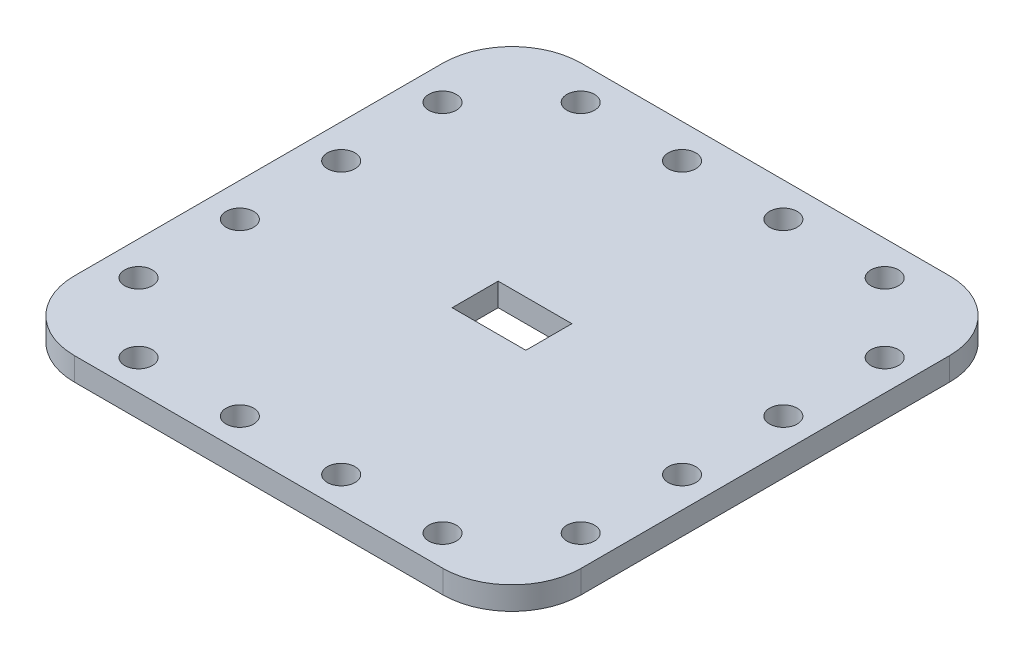
ISO-10303-21;
HEADER;
FILE_DESCRIPTION(('STEP AP214'),'2;1');
FILE_NAME('part.step','',(''),(''),'','','');
FILE_SCHEMA(('AUTOMOTIVE_DESIGN { 1 0 10303 214 1 1 1 1 }'));
ENDSEC;
DATA;
#1=APPLICATION_CONTEXT('core data for automotive mechanical design processes');
#2=APPLICATION_PROTOCOL_DEFINITION('international standard','automotive_design',2000,#1);
#3=PRODUCT_CONTEXT('',#1,'mechanical');
#4=PRODUCT('Part','Part','',(#3));
#5=PRODUCT_RELATED_PRODUCT_CATEGORY('part','',(#4));
#6=PRODUCT_DEFINITION_FORMATION('','',#4);
#7=PRODUCT_DEFINITION_CONTEXT('part definition',#1,'design');
#8=PRODUCT_DEFINITION('design','',#6,#7);
#9=PRODUCT_DEFINITION_SHAPE('','',#8);
#10=(LENGTH_UNIT() NAMED_UNIT(*) SI_UNIT(.MILLI.,.METRE.));
#11=(NAMED_UNIT(*) PLANE_ANGLE_UNIT() SI_UNIT($,.RADIAN.));
#12=(NAMED_UNIT(*) SI_UNIT($,.STERADIAN.) SOLID_ANGLE_UNIT());
#13=UNCERTAINTY_MEASURE_WITH_UNIT(LENGTH_MEASURE(1.E-05),#10,'distance_accuracy_value','');
#14=(GEOMETRIC_REPRESENTATION_CONTEXT(3) GLOBAL_UNCERTAINTY_ASSIGNED_CONTEXT((#13)) GLOBAL_UNIT_ASSIGNED_CONTEXT((#10,
#11,#12)) REPRESENTATION_CONTEXT('',''));
#15=CARTESIAN_POINT('',(0.,0.,0.));
#16=DIRECTION('',(0.,0.,1.));
#17=DIRECTION('',(1.,0.,0.));
#18=AXIS2_PLACEMENT_3D('',#15,#16,#17);
#19=CARTESIAN_POINT('',(40.,5.,55.));
#20=DIRECTION('',(0.,1.,0.));
#21=DIRECTION('',(0.,0.,1.));
#22=AXIS2_PLACEMENT_3D('',#19,#20,#21);
#23=PLANE('',#22);
#24=DIRECTION('',(0.,0.,-1.));
#25=VECTOR('',#24,1.);
#26=CARTESIAN_POINT('',(8.,5.,5.));
#27=LINE('',#26,#25);
#28=CARTESIAN_POINT('',(8.,5.,5.));
#29=VERTEX_POINT('',#28);
#30=CARTESIAN_POINT('',(8.,5.,-5.));
#31=VERTEX_POINT('',#30);
#32=EDGE_CURVE('E54',#29,#31,#27,.T.);
#33=ORIENTED_EDGE('',*,*,#32,.F.);
#34=DIRECTION('',(1.,0.,0.));
#35=VECTOR('',#34,1.);
#36=CARTESIAN_POINT('',(-8.,5.,5.));
#37=LINE('',#36,#35);
#38=CARTESIAN_POINT('',(-8.,5.,5.));
#39=VERTEX_POINT('',#38);
#40=EDGE_CURVE('E145',#39,#29,#37,.T.);
#41=ORIENTED_EDGE('',*,*,#40,.F.);
#42=DIRECTION('',(0.,0.,1.));
#43=VECTOR('',#42,1.);
#44=CARTESIAN_POINT('',(-8.,5.,5.));
#45=LINE('',#44,#43);
#46=CARTESIAN_POINT('',(-8.,5.,-5.));
#47=VERTEX_POINT('',#46);
#48=EDGE_CURVE('E130',#47,#39,#45,.T.);
#49=ORIENTED_EDGE('',*,*,#48,.F.);
#50=DIRECTION('',(-1.,0.,0.));
#51=VECTOR('',#50,1.);
#52=CARTESIAN_POINT('',(-8.,5.,-5.));
#53=LINE('',#52,#51);
#54=EDGE_CURVE('E139',#31,#47,#53,.T.);
#55=ORIENTED_EDGE('',*,*,#54,.F.);
#56=EDGE_LOOP('',(#33,#41,#49,#55));
#57=FACE_BOUND('',#56,.T.);
#58=CARTESIAN_POINT('',(48.3346963055934,5.,-10.5816296180082));
#59=DIRECTION('',(0.,-1.,0.));
#60=DIRECTION('',(0.,0.,-1.));
#61=AXIS2_PLACEMENT_3D('',#58,#59,#60);
#62=CIRCLE('',#61,3.00000000000002);
#63=CARTESIAN_POINT('',(48.3346963055934,5.,-13.5816296180082));
#64=VERTEX_POINT('',#63);
#65=EDGE_CURVE('E208',#64,#64,#62,.T.);
#66=ORIENTED_EDGE('',*,*,#65,.T.);
#67=EDGE_LOOP('',(#66));
#68=FACE_BOUND('',#67,.T.);
#69=CARTESIAN_POINT('',(-32.6653036944065,5.,-47.5816296180083));
#70=DIRECTION('',(0.,-1.,0.));
#71=DIRECTION('',(0.,0.,-1.));
#72=AXIS2_PLACEMENT_3D('',#69,#70,#71);
#73=CIRCLE('',#72,3.00000000000001);
#74=CARTESIAN_POINT('',(-32.6653036944065,5.,-50.5816296180083));
#75=VERTEX_POINT('',#74);
#76=EDGE_CURVE('E220',#75,#75,#73,.T.);
#77=ORIENTED_EDGE('',*,*,#76,.T.);
#78=EDGE_LOOP('',(#77));
#79=FACE_BOUND('',#78,.T.);
#80=CARTESIAN_POINT('',(-47.6653036944066,5.,-32.5816296180082));
#81=DIRECTION('',(0.,-1.,0.));
#82=DIRECTION('',(0.,0.,-1.));
#83=AXIS2_PLACEMENT_3D('',#80,#81,#82);
#84=CIRCLE('',#83,3.);
#85=CARTESIAN_POINT('',(-47.6653036944066,5.,-35.5816296180082));
#86=VERTEX_POINT('',#85);
#87=EDGE_CURVE('E223',#86,#86,#84,.T.);
#88=ORIENTED_EDGE('',*,*,#87,.T.);
#89=EDGE_LOOP('',(#88));
#90=FACE_BOUND('',#89,.T.);
#91=CARTESIAN_POINT('',(-47.6653036944066,5.,-10.5816296180082));
#92=DIRECTION('',(0.,-1.,0.));
#93=DIRECTION('',(0.,0.,-1.));
#94=AXIS2_PLACEMENT_3D('',#91,#92,#93);
#95=CIRCLE('',#94,3.00000000000003);
#96=CARTESIAN_POINT('',(-47.6653036944066,5.,-13.5816296180083));
#97=VERTEX_POINT('',#96);
#98=EDGE_CURVE('E226',#97,#97,#95,.T.);
#99=ORIENTED_EDGE('',*,*,#98,.T.);
#100=EDGE_LOOP('',(#99));
#101=FACE_BOUND('',#100,.T.);
#102=CARTESIAN_POINT('',(-47.6653036944066,5.,11.4183703819918));
#103=DIRECTION('',(0.,-1.,0.));
#104=DIRECTION('',(0.,0.,-1.));
#105=AXIS2_PLACEMENT_3D('',#102,#103,#104);
#106=CIRCLE('',#105,2.99999999999997);
#107=CARTESIAN_POINT('',(-47.6653036944066,5.,8.4183703819918));
#108=VERTEX_POINT('',#107);
#109=EDGE_CURVE('E229',#108,#108,#106,.T.);
#110=ORIENTED_EDGE('',*,*,#109,.T.);
#111=EDGE_LOOP('',(#110));
#112=FACE_BOUND('',#111,.T.);
#113=CARTESIAN_POINT('',(-10.6653036944066,5.,48.4183703819918));
#114=DIRECTION('',(0.,-1.,0.));
#115=DIRECTION('',(0.,0.,-1.));
#116=AXIS2_PLACEMENT_3D('',#113,#114,#115);
#117=CIRCLE('',#116,3.00000000000002);
#118=CARTESIAN_POINT('',(-10.6653036944066,5.,45.4183703819917));
#119=VERTEX_POINT('',#118);
#120=EDGE_CURVE('E232',#119,#119,#117,.T.);
#121=ORIENTED_EDGE('',*,*,#120,.T.);
#122=EDGE_LOOP('',(#121));
#123=FACE_BOUND('',#122,.T.);
#124=CARTESIAN_POINT('',(11.3346963055934,5.,48.4183703819918));
#125=DIRECTION('',(0.,-1.,0.));
#126=DIRECTION('',(0.,0.,-1.));
#127=AXIS2_PLACEMENT_3D('',#124,#125,#126);
#128=CIRCLE('',#127,2.99999999999997);
#129=CARTESIAN_POINT('',(11.3346963055934,5.,45.4183703819918));
#130=VERTEX_POINT('',#129);
#131=EDGE_CURVE('E235',#130,#130,#128,.T.);
#132=ORIENTED_EDGE('',*,*,#131,.T.);
#133=EDGE_LOOP('',(#132));
#134=FACE_BOUND('',#133,.T.);
#135=CARTESIAN_POINT('',(33.3346963055934,5.,48.4183703819918));
#136=DIRECTION('',(0.,-1.,0.));
#137=DIRECTION('',(0.,0.,-1.));
#138=AXIS2_PLACEMENT_3D('',#135,#136,#137);
#139=CIRCLE('',#138,3.00000000000001);
#140=CARTESIAN_POINT('',(33.3346963055934,5.,45.4183703819917));
#141=VERTEX_POINT('',#140);
#142=EDGE_CURVE('E238',#141,#141,#139,.T.);
#143=ORIENTED_EDGE('',*,*,#142,.T.);
#144=EDGE_LOOP('',(#143));
#145=FACE_BOUND('',#144,.T.);
#146=CARTESIAN_POINT('',(48.3346963055934,5.,11.4183703819918));
#147=DIRECTION('',(0.,-1.,0.));
#148=DIRECTION('',(0.,0.,-1.));
#149=AXIS2_PLACEMENT_3D('',#146,#147,#148);
#150=CIRCLE('',#149,2.99999999999997);
#151=CARTESIAN_POINT('',(48.3346963055934,5.,8.4183703819918));
#152=VERTEX_POINT('',#151);
#153=EDGE_CURVE('E241',#152,#152,#150,.T.);
#154=ORIENTED_EDGE('',*,*,#153,.T.);
#155=EDGE_LOOP('',(#154));
#156=FACE_BOUND('',#155,.T.);
#157=CARTESIAN_POINT('',(48.3346963055935,5.,-32.5816296180082));
#158=DIRECTION('',(0.,-1.,0.));
#159=DIRECTION('',(0.,0.,-1.));
#160=AXIS2_PLACEMENT_3D('',#157,#158,#159);
#161=CIRCLE('',#160,3.00000000000001);
#162=CARTESIAN_POINT('',(48.3346963055935,5.,-35.5816296180082));
#163=VERTEX_POINT('',#162);
#164=EDGE_CURVE('E244',#163,#163,#161,.T.);
#165=ORIENTED_EDGE('',*,*,#164,.T.);
#166=EDGE_LOOP('',(#165));
#167=FACE_BOUND('',#166,.T.);
#168=CARTESIAN_POINT('',(33.3346963055935,5.,-47.5816296180082));
#169=DIRECTION('',(0.,-1.,0.));
#170=DIRECTION('',(0.,0.,-1.));
#171=AXIS2_PLACEMENT_3D('',#168,#169,#170);
#172=CIRCLE('',#171,2.99999999999997);
#173=CARTESIAN_POINT('',(33.3346963055935,5.,-50.5816296180082));
#174=VERTEX_POINT('',#173);
#175=EDGE_CURVE('E247',#174,#174,#172,.T.);
#176=ORIENTED_EDGE('',*,*,#175,.T.);
#177=EDGE_LOOP('',(#176));
#178=FACE_BOUND('',#177,.T.);
#179=CARTESIAN_POINT('',(11.3346963055935,5.,-47.5816296180082));
#180=DIRECTION('',(0.,-1.,0.));
#181=DIRECTION('',(0.,0.,-1.));
#182=AXIS2_PLACEMENT_3D('',#179,#180,#181);
#183=CIRCLE('',#182,2.99999999999997);
#184=CARTESIAN_POINT('',(11.3346963055935,5.,-50.5816296180082));
#185=VERTEX_POINT('',#184);
#186=EDGE_CURVE('E250',#185,#185,#183,.T.);
#187=ORIENTED_EDGE('',*,*,#186,.T.);
#188=EDGE_LOOP('',(#187));
#189=FACE_BOUND('',#188,.T.);
#190=CARTESIAN_POINT('',(-10.6653036944065,5.,-47.5816296180082));
#191=DIRECTION('',(0.,-1.,0.));
#192=DIRECTION('',(0.,0.,-1.));
#193=AXIS2_PLACEMENT_3D('',#190,#191,#192);
#194=CIRCLE('',#193,3.00000000000002);
#195=CARTESIAN_POINT('',(-10.6653036944065,5.,-50.5816296180083));
#196=VERTEX_POINT('',#195);
#197=EDGE_CURVE('E253',#196,#196,#194,.T.);
#198=ORIENTED_EDGE('',*,*,#197,.T.);
#199=EDGE_LOOP('',(#198));
#200=FACE_BOUND('',#199,.T.);
#201=CARTESIAN_POINT('',(-47.6653036944065,5.,33.4183703819918));
#202=DIRECTION('',(0.,-1.,0.));
#203=DIRECTION('',(0.,0.,-1.));
#204=AXIS2_PLACEMENT_3D('',#201,#202,#203);
#205=CIRCLE('',#204,3.);
#206=CARTESIAN_POINT('',(-47.6653036944065,5.,30.4183703819918));
#207=VERTEX_POINT('',#206);
#208=EDGE_CURVE('E256',#207,#207,#205,.T.);
#209=ORIENTED_EDGE('',*,*,#208,.T.);
#210=EDGE_LOOP('',(#209));
#211=FACE_BOUND('',#210,.T.);
#212=CARTESIAN_POINT('',(-32.6653036944065,5.,48.4183703819918));
#213=DIRECTION('',(0.,-1.,0.));
#214=DIRECTION('',(0.,0.,-1.));
#215=AXIS2_PLACEMENT_3D('',#212,#213,#214);
#216=CIRCLE('',#215,3.00000000000001);
#217=CARTESIAN_POINT('',(-32.6653036944065,5.,45.4183703819918));
#218=VERTEX_POINT('',#217);
#219=EDGE_CURVE('E259',#218,#218,#216,.T.);
#220=ORIENTED_EDGE('',*,*,#219,.T.);
#221=EDGE_LOOP('',(#220));
#222=FACE_BOUND('',#221,.T.);
#223=CARTESIAN_POINT('',(48.3346963055934,5.,33.4183703819918));
#224=DIRECTION('',(0.,-1.,0.));
#225=DIRECTION('',(0.,0.,-1.));
#226=AXIS2_PLACEMENT_3D('',#223,#224,#225);
#227=CIRCLE('',#226,3.00000000000001);
#228=CARTESIAN_POINT('',(48.3346963055934,5.,30.4183703819918));
#229=VERTEX_POINT('',#228);
#230=EDGE_CURVE('E262',#229,#229,#227,.T.);
#231=ORIENTED_EDGE('',*,*,#230,.T.);
#232=EDGE_LOOP('',(#231));
#233=FACE_BOUND('',#232,.T.);
#234=DIRECTION('',(1.,0.,0.));
#235=VECTOR('',#234,1.);
#236=CARTESIAN_POINT('',(-55.,5.,55.));
#237=LINE('',#236,#235);
#238=CARTESIAN_POINT('',(-40.,5.,55.));
#239=VERTEX_POINT('',#238);
#240=CARTESIAN_POINT('',(40.,5.,55.));
#241=VERTEX_POINT('',#240);
#242=EDGE_CURVE('E195',#239,#241,#237,.T.);
#243=ORIENTED_EDGE('',*,*,#242,.T.);
#244=CARTESIAN_POINT('',(40.,5.,40.));
#245=DIRECTION('',(0.,-1.,0.));
#246=DIRECTION('',(0.,0.,-1.));
#247=AXIS2_PLACEMENT_3D('',#244,#245,#246);
#248=CIRCLE('',#247,15.);
#249=CARTESIAN_POINT('',(55.,5.,40.));
#250=VERTEX_POINT('',#249);
#251=EDGE_CURVE('E152',#241,#250,#248,.F.);
#252=ORIENTED_EDGE('',*,*,#251,.T.);
#253=DIRECTION('',(0.,0.,-1.));
#254=VECTOR('',#253,1.);
#255=CARTESIAN_POINT('',(55.,5.,55.));
#256=LINE('',#255,#254);
#257=CARTESIAN_POINT('',(55.,5.,-40.));
#258=VERTEX_POINT('',#257);
#259=EDGE_CURVE('E200',#250,#258,#256,.T.);
#260=ORIENTED_EDGE('',*,*,#259,.T.);
#261=CARTESIAN_POINT('',(40.,5.,-40.));
#262=DIRECTION('',(0.,-1.,0.));
#263=DIRECTION('',(0.,0.,-1.));
#264=AXIS2_PLACEMENT_3D('',#261,#262,#263);
#265=CIRCLE('',#264,15.);
#266=CARTESIAN_POINT('',(40.,5.,-55.));
#267=VERTEX_POINT('',#266);
#268=EDGE_CURVE('E184',#258,#267,#265,.F.);
#269=ORIENTED_EDGE('',*,*,#268,.T.);
#270=DIRECTION('',(-1.,0.,0.));
#271=VECTOR('',#270,1.);
#272=CARTESIAN_POINT('',(-55.,5.,-55.));
#273=LINE('',#272,#271);
#274=CARTESIAN_POINT('',(-40.,5.,-55.));
#275=VERTEX_POINT('',#274);
#276=EDGE_CURVE('E214',#267,#275,#273,.T.);
#277=ORIENTED_EDGE('',*,*,#276,.T.);
#278=CARTESIAN_POINT('',(-40.,5.,-40.));
#279=DIRECTION('',(0.,-1.,0.));
#280=DIRECTION('',(0.,0.,-1.));
#281=AXIS2_PLACEMENT_3D('',#278,#279,#280);
#282=CIRCLE('',#281,15.);
#283=CARTESIAN_POINT('',(-55.,5.,-40.));
#284=VERTEX_POINT('',#283);
#285=EDGE_CURVE('E174',#275,#284,#282,.F.);
#286=ORIENTED_EDGE('',*,*,#285,.T.);
#287=DIRECTION('',(0.,0.,1.));
#288=VECTOR('',#287,1.);
#289=CARTESIAN_POINT('',(-55.,5.,55.));
#290=LINE('',#289,#288);
#291=CARTESIAN_POINT('',(-55.,5.,40.));
#292=VERTEX_POINT('',#291);
#293=EDGE_CURVE('E211',#284,#292,#290,.T.);
#294=ORIENTED_EDGE('',*,*,#293,.T.);
#295=CARTESIAN_POINT('',(-40.,5.,40.));
#296=DIRECTION('',(0.,-1.,0.));
#297=DIRECTION('',(0.,0.,-1.));
#298=AXIS2_PLACEMENT_3D('',#295,#296,#297);
#299=CIRCLE('',#298,15.);
#300=EDGE_CURVE('E164',#292,#239,#299,.F.);
#301=ORIENTED_EDGE('',*,*,#300,.T.);
#302=EDGE_LOOP('',(#243,#252,#260,#269,#277,#286,#294,#301));
#303=FACE_BOUND('',#302,.T.);
#304=ADVANCED_FACE('F40',(#57,#68,#79,#90,#101,#112,#123,#134,#145,#156,#167,#178,#189,#200,
#211,#222,#233,#303),#23,.T.);
#305=CARTESIAN_POINT('',(40.,5.,-40.));
#306=DIRECTION('',(0.,1.,0.));
#307=DIRECTION('',(0.,0.,1.));
#308=AXIS2_PLACEMENT_3D('',#305,#306,#307);
#309=CYLINDRICAL_SURFACE('',#308,15.);
#310=DIRECTION('',(0.,1.,0.));
#311=VECTOR('',#310,1.);
#312=CARTESIAN_POINT('',(55.,5.,-40.));
#313=LINE('',#312,#311);
#314=CARTESIAN_POINT('',(55.,0.,-40.));
#315=VERTEX_POINT('',#314);
#316=EDGE_CURVE('E192',#315,#258,#313,.T.);
#317=ORIENTED_EDGE('',*,*,#316,.F.);
#318=CARTESIAN_POINT('',(40.,0.,-40.));
#319=DIRECTION('',(0.,-1.,0.));
#320=DIRECTION('',(0.,0.,-1.));
#321=AXIS2_PLACEMENT_3D('',#318,#319,#320);
#322=CIRCLE('',#321,15.);
#323=CARTESIAN_POINT('',(40.,0.,-55.));
#324=VERTEX_POINT('',#323);
#325=EDGE_CURVE('E186',#324,#315,#322,.T.);
#326=ORIENTED_EDGE('',*,*,#325,.F.);
#327=DIRECTION('',(0.,1.,0.));
#328=VECTOR('',#327,1.);
#329=CARTESIAN_POINT('',(40.,5.,-55.));
#330=LINE('',#329,#328);
#331=EDGE_CURVE('E189',#267,#324,#330,.F.);
#332=ORIENTED_EDGE('',*,*,#331,.F.);
#333=ORIENTED_EDGE('',*,*,#268,.F.);
#334=EDGE_LOOP('',(#317,#326,#332,#333));
#335=FACE_BOUND('',#334,.T.);
#336=ADVANCED_FACE('F338',(#335),#309,.T.);
#337=CARTESIAN_POINT('',(-40.,5.,-40.));
#338=DIRECTION('',(0.,1.,0.));
#339=DIRECTION('',(0.,0.,1.));
#340=AXIS2_PLACEMENT_3D('',#337,#338,#339);
#341=CYLINDRICAL_SURFACE('',#340,15.);
#342=DIRECTION('',(0.,1.,0.));
#343=VECTOR('',#342,1.);
#344=CARTESIAN_POINT('',(-40.,5.,-55.));
#345=LINE('',#344,#343);
#346=CARTESIAN_POINT('',(-40.,0.,-55.));
#347=VERTEX_POINT('',#346);
#348=EDGE_CURVE('E181',#347,#275,#345,.T.);
#349=ORIENTED_EDGE('',*,*,#348,.F.);
#350=CARTESIAN_POINT('',(-40.,0.,-40.));
#351=DIRECTION('',(0.,-1.,0.));
#352=DIRECTION('',(0.,0.,-1.));
#353=AXIS2_PLACEMENT_3D('',#350,#351,#352);
#354=CIRCLE('',#353,15.);
#355=CARTESIAN_POINT('',(-55.,0.,-40.));
#356=VERTEX_POINT('',#355);
#357=EDGE_CURVE('E176',#356,#347,#354,.T.);
#358=ORIENTED_EDGE('',*,*,#357,.F.);
#359=DIRECTION('',(0.,1.,0.));
#360=VECTOR('',#359,1.);
#361=CARTESIAN_POINT('',(-55.,5.,-40.));
#362=LINE('',#361,#360);
#363=EDGE_CURVE('E178',#284,#356,#362,.F.);
#364=ORIENTED_EDGE('',*,*,#363,.F.);
#365=ORIENTED_EDGE('',*,*,#285,.F.);
#366=EDGE_LOOP('',(#349,#358,#364,#365));
#367=FACE_BOUND('',#366,.T.);
#368=ADVANCED_FACE('F340',(#367),#341,.T.);
#369=CARTESIAN_POINT('',(-40.,5.,40.));
#370=DIRECTION('',(0.,1.,0.));
#371=DIRECTION('',(0.,0.,1.));
#372=AXIS2_PLACEMENT_3D('',#369,#370,#371);
#373=CYLINDRICAL_SURFACE('',#372,15.);
#374=DIRECTION('',(0.,1.,0.));
#375=VECTOR('',#374,1.);
#376=CARTESIAN_POINT('',(-55.,5.,40.));
#377=LINE('',#376,#375);
#378=CARTESIAN_POINT('',(-55.,0.,40.));
#379=VERTEX_POINT('',#378);
#380=EDGE_CURVE('E171',#379,#292,#377,.T.);
#381=ORIENTED_EDGE('',*,*,#380,.F.);
#382=CARTESIAN_POINT('',(-40.,0.,40.));
#383=DIRECTION('',(0.,-1.,0.));
#384=DIRECTION('',(0.,0.,-1.));
#385=AXIS2_PLACEMENT_3D('',#382,#383,#384);
#386=CIRCLE('',#385,15.);
#387=CARTESIAN_POINT('',(-40.,0.,55.));
#388=VERTEX_POINT('',#387);
#389=EDGE_CURVE('E166',#388,#379,#386,.T.);
#390=ORIENTED_EDGE('',*,*,#389,.F.);
#391=DIRECTION('',(0.,1.,0.));
#392=VECTOR('',#391,1.);
#393=CARTESIAN_POINT('',(-40.,5.,55.));
#394=LINE('',#393,#392);
#395=EDGE_CURVE('E168',#239,#388,#394,.F.);
#396=ORIENTED_EDGE('',*,*,#395,.F.);
#397=ORIENTED_EDGE('',*,*,#300,.F.);
#398=EDGE_LOOP('',(#381,#390,#396,#397));
#399=FACE_BOUND('',#398,.T.);
#400=ADVANCED_FACE('F346',(#399),#373,.T.);
#401=CARTESIAN_POINT('',(40.,5.,40.));
#402=DIRECTION('',(0.,1.,0.));
#403=DIRECTION('',(0.,0.,1.));
#404=AXIS2_PLACEMENT_3D('',#401,#402,#403);
#405=CYLINDRICAL_SURFACE('',#404,15.);
#406=DIRECTION('',(0.,1.,0.));
#407=VECTOR('',#406,1.);
#408=CARTESIAN_POINT('',(40.,5.,55.));
#409=LINE('',#408,#407);
#410=CARTESIAN_POINT('',(40.,0.,55.));
#411=VERTEX_POINT('',#410);
#412=EDGE_CURVE('E161',#411,#241,#409,.T.);
#413=ORIENTED_EDGE('',*,*,#412,.F.);
#414=CARTESIAN_POINT('',(40.,0.,40.));
#415=DIRECTION('',(0.,-1.,0.));
#416=DIRECTION('',(0.,0.,-1.));
#417=AXIS2_PLACEMENT_3D('',#414,#415,#416);
#418=CIRCLE('',#417,15.);
#419=CARTESIAN_POINT('',(55.,0.,40.));
#420=VERTEX_POINT('',#419);
#421=EDGE_CURVE('E156',#420,#411,#418,.T.);
#422=ORIENTED_EDGE('',*,*,#421,.F.);
#423=DIRECTION('',(0.,1.,0.));
#424=VECTOR('',#423,1.);
#425=CARTESIAN_POINT('',(55.,5.,40.));
#426=LINE('',#425,#424);
#427=EDGE_CURVE('E158',#250,#420,#426,.F.);
#428=ORIENTED_EDGE('',*,*,#427,.F.);
#429=ORIENTED_EDGE('',*,*,#251,.F.);
#430=EDGE_LOOP('',(#413,#422,#428,#429));
#431=FACE_BOUND('',#430,.T.);
#432=ADVANCED_FACE('F367',(#431),#405,.T.);
#433=CARTESIAN_POINT('',(0.,0.,0.));
#434=DIRECTION('',(0.,-1.,0.));
#435=DIRECTION('',(0.,0.,-1.));
#436=AXIS2_PLACEMENT_3D('',#433,#434,#435);
#437=PLANE('',#436);
#438=DIRECTION('',(0.,0.,1.));
#439=VECTOR('',#438,1.);
#440=CARTESIAN_POINT('',(8.,0.,0.));
#441=LINE('',#440,#439);
#442=CARTESIAN_POINT('',(8.,0.,-5.));
#443=VERTEX_POINT('',#442);
#444=CARTESIAN_POINT('',(8.,0.,5.));
#445=VERTEX_POINT('',#444);
#446=EDGE_CURVE('E11',#443,#445,#441,.T.);
#447=ORIENTED_EDGE('',*,*,#446,.F.);
#448=DIRECTION('',(1.,0.,0.));
#449=VECTOR('',#448,1.);
#450=CARTESIAN_POINT('',(0.,0.,-5.));
#451=LINE('',#450,#449);
#452=CARTESIAN_POINT('',(-8.,0.,-5.));
#453=VERTEX_POINT('',#452);
#454=EDGE_CURVE('E296',#453,#443,#451,.T.);
#455=ORIENTED_EDGE('',*,*,#454,.F.);
#456=DIRECTION('',(0.,0.,-1.));
#457=VECTOR('',#456,1.);
#458=CARTESIAN_POINT('',(-8.,0.,0.));
#459=LINE('',#458,#457);
#460=CARTESIAN_POINT('',(-8.,0.,5.));
#461=VERTEX_POINT('',#460);
#462=EDGE_CURVE('E133',#461,#453,#459,.T.);
#463=ORIENTED_EDGE('',*,*,#462,.F.);
#464=DIRECTION('',(-1.,0.,0.));
#465=VECTOR('',#464,1.);
#466=CARTESIAN_POINT('',(0.,0.,5.));
#467=LINE('',#466,#465);
#468=EDGE_CURVE('E47',#445,#461,#467,.T.);
#469=ORIENTED_EDGE('',*,*,#468,.F.);
#470=EDGE_LOOP('',(#447,#455,#463,#469));
#471=FACE_BOUND('',#470,.T.);
#472=CARTESIAN_POINT('',(48.3346963055934,0.,-10.5816296180082));
#473=DIRECTION('',(0.,-1.,0.));
#474=DIRECTION('',(0.,0.,-1.));
#475=AXIS2_PLACEMENT_3D('',#472,#473,#474);
#476=CIRCLE('',#475,3.00000000000002);
#477=CARTESIAN_POINT('',(48.3346963055934,0.,-13.5816296180082));
#478=VERTEX_POINT('',#477);
#479=EDGE_CURVE('E268',#478,#478,#476,.T.);
#480=ORIENTED_EDGE('',*,*,#479,.F.);
#481=EDGE_LOOP('',(#480));
#482=FACE_BOUND('',#481,.T.);
#483=CARTESIAN_POINT('',(-32.6653036944065,0.,-47.5816296180083));
#484=DIRECTION('',(0.,-1.,0.));
#485=DIRECTION('',(0.,0.,-1.));
#486=AXIS2_PLACEMENT_3D('',#483,#484,#485);
#487=CIRCLE('',#486,3.00000000000001);
#488=CARTESIAN_POINT('',(-32.6653036944065,0.,-50.5816296180083));
#489=VERTEX_POINT('',#488);
#490=EDGE_CURVE('E288',#489,#489,#487,.T.);
#491=ORIENTED_EDGE('',*,*,#490,.F.);
#492=EDGE_LOOP('',(#491));
#493=FACE_BOUND('',#492,.T.);
#494=CARTESIAN_POINT('',(-47.6653036944066,0.,-32.5816296180082));
#495=DIRECTION('',(0.,-1.,0.));
#496=DIRECTION('',(0.,0.,-1.));
#497=AXIS2_PLACEMENT_3D('',#494,#495,#496);
#498=CIRCLE('',#497,3.);
#499=CARTESIAN_POINT('',(-47.6653036944066,0.,-35.5816296180082));
#500=VERTEX_POINT('',#499);
#501=EDGE_CURVE('E285',#500,#500,#498,.T.);
#502=ORIENTED_EDGE('',*,*,#501,.F.);
#503=EDGE_LOOP('',(#502));
#504=FACE_BOUND('',#503,.T.);
#505=CARTESIAN_POINT('',(-47.6653036944066,0.,-10.5816296180082));
#506=DIRECTION('',(0.,-1.,0.));
#507=DIRECTION('',(0.,0.,-1.));
#508=AXIS2_PLACEMENT_3D('',#505,#506,#507);
#509=CIRCLE('',#508,3.00000000000003);
#510=CARTESIAN_POINT('',(-47.6653036944066,0.,-13.5816296180083));
#511=VERTEX_POINT('',#510);
#512=EDGE_CURVE('E282',#511,#511,#509,.T.);
#513=ORIENTED_EDGE('',*,*,#512,.F.);
#514=EDGE_LOOP('',(#513));
#515=FACE_BOUND('',#514,.T.);
#516=CARTESIAN_POINT('',(-47.6653036944066,0.,11.4183703819918));
#517=DIRECTION('',(0.,-1.,0.));
#518=DIRECTION('',(0.,0.,-1.));
#519=AXIS2_PLACEMENT_3D('',#516,#517,#518);
#520=CIRCLE('',#519,2.99999999999997);
#521=CARTESIAN_POINT('',(-47.6653036944066,0.,8.4183703819918));
#522=VERTEX_POINT('',#521);
#523=EDGE_CURVE('E279',#522,#522,#520,.T.);
#524=ORIENTED_EDGE('',*,*,#523,.F.);
#525=EDGE_LOOP('',(#524));
#526=FACE_BOUND('',#525,.T.);
#527=CARTESIAN_POINT('',(-10.6653036944066,0.,48.4183703819918));
#528=DIRECTION('',(0.,-1.,0.));
#529=DIRECTION('',(0.,0.,-1.));
#530=AXIS2_PLACEMENT_3D('',#527,#528,#529);
#531=CIRCLE('',#530,3.00000000000002);
#532=CARTESIAN_POINT('',(-10.6653036944066,0.,45.4183703819917));
#533=VERTEX_POINT('',#532);
#534=EDGE_CURVE('E276',#533,#533,#531,.T.);
#535=ORIENTED_EDGE('',*,*,#534,.F.);
#536=EDGE_LOOP('',(#535));
#537=FACE_BOUND('',#536,.T.);
#538=CARTESIAN_POINT('',(11.3346963055934,0.,48.4183703819918));
#539=DIRECTION('',(0.,-1.,0.));
#540=DIRECTION('',(0.,0.,-1.));
#541=AXIS2_PLACEMENT_3D('',#538,#539,#540);
#542=CIRCLE('',#541,2.99999999999997);
#543=CARTESIAN_POINT('',(11.3346963055934,0.,45.4183703819918));
#544=VERTEX_POINT('',#543);
#545=EDGE_CURVE('E273',#544,#544,#542,.T.);
#546=ORIENTED_EDGE('',*,*,#545,.F.);
#547=EDGE_LOOP('',(#546));
#548=FACE_BOUND('',#547,.T.);
#549=CARTESIAN_POINT('',(33.3346963055934,0.,48.4183703819918));
#550=DIRECTION('',(0.,-1.,0.));
#551=DIRECTION('',(0.,0.,-1.));
#552=AXIS2_PLACEMENT_3D('',#549,#550,#551);
#553=CIRCLE('',#552,3.00000000000001);
#554=CARTESIAN_POINT('',(33.3346963055934,0.,45.4183703819917));
#555=VERTEX_POINT('',#554);
#556=EDGE_CURVE('E269',#555,#555,#553,.T.);
#557=ORIENTED_EDGE('',*,*,#556,.F.);
#558=EDGE_LOOP('',(#557));
#559=FACE_BOUND('',#558,.T.);
#560=CARTESIAN_POINT('',(48.3346963055934,0.,11.4183703819918));
#561=DIRECTION('',(0.,-1.,0.));
#562=DIRECTION('',(0.,0.,-1.));
#563=AXIS2_PLACEMENT_3D('',#560,#561,#562);
#564=CIRCLE('',#563,2.99999999999997);
#565=CARTESIAN_POINT('',(48.3346963055934,0.,8.4183703819918));
#566=VERTEX_POINT('',#565);
#567=EDGE_CURVE('E272',#566,#566,#564,.T.);
#568=ORIENTED_EDGE('',*,*,#567,.F.);
#569=EDGE_LOOP('',(#568));
#570=FACE_BOUND('',#569,.T.);
#571=CARTESIAN_POINT('',(48.3346963055935,0.,-32.5816296180082));
#572=DIRECTION('',(0.,-1.,0.));
#573=DIRECTION('',(0.,0.,-1.));
#574=AXIS2_PLACEMENT_3D('',#571,#572,#573);
#575=CIRCLE('',#574,3.00000000000001);
#576=CARTESIAN_POINT('',(48.3346963055935,0.,-35.5816296180082));
#577=VERTEX_POINT('',#576);
#578=EDGE_CURVE('E309',#577,#577,#575,.T.);
#579=ORIENTED_EDGE('',*,*,#578,.F.);
#580=EDGE_LOOP('',(#579));
#581=FACE_BOUND('',#580,.T.);
#582=CARTESIAN_POINT('',(33.3346963055935,0.,-47.5816296180082));
#583=DIRECTION('',(0.,-1.,0.));
#584=DIRECTION('',(0.,0.,-1.));
#585=AXIS2_PLACEMENT_3D('',#582,#583,#584);
#586=CIRCLE('',#585,2.99999999999997);
#587=CARTESIAN_POINT('',(33.3346963055935,0.,-50.5816296180082));
#588=VERTEX_POINT('',#587);
#589=EDGE_CURVE('E306',#588,#588,#586,.T.);
#590=ORIENTED_EDGE('',*,*,#589,.F.);
#591=EDGE_LOOP('',(#590));
#592=FACE_BOUND('',#591,.T.);
#593=CARTESIAN_POINT('',(11.3346963055935,0.,-47.5816296180082));
#594=DIRECTION('',(0.,-1.,0.));
#595=DIRECTION('',(0.,0.,-1.));
#596=AXIS2_PLACEMENT_3D('',#593,#594,#595);
#597=CIRCLE('',#596,2.99999999999997);
#598=CARTESIAN_POINT('',(11.3346963055935,0.,-50.5816296180082));
#599=VERTEX_POINT('',#598);
#600=EDGE_CURVE('E303',#599,#599,#597,.T.);
#601=ORIENTED_EDGE('',*,*,#600,.F.);
#602=EDGE_LOOP('',(#601));
#603=FACE_BOUND('',#602,.T.);
#604=CARTESIAN_POINT('',(-10.6653036944065,0.,-47.5816296180082));
#605=DIRECTION('',(0.,-1.,0.));
#606=DIRECTION('',(0.,0.,-1.));
#607=AXIS2_PLACEMENT_3D('',#604,#605,#606);
#608=CIRCLE('',#607,3.00000000000002);
#609=CARTESIAN_POINT('',(-10.6653036944065,0.,-50.5816296180083));
#610=VERTEX_POINT('',#609);
#611=EDGE_CURVE('E300',#610,#610,#608,.T.);
#612=ORIENTED_EDGE('',*,*,#611,.F.);
#613=EDGE_LOOP('',(#612));
#614=FACE_BOUND('',#613,.T.);
#615=CARTESIAN_POINT('',(-47.6653036944065,0.,33.4183703819918));
#616=DIRECTION('',(0.,-1.,0.));
#617=DIRECTION('',(0.,0.,-1.));
#618=AXIS2_PLACEMENT_3D('',#615,#616,#617);
#619=CIRCLE('',#618,3.);
#620=CARTESIAN_POINT('',(-47.6653036944065,0.,30.4183703819918));
#621=VERTEX_POINT('',#620);
#622=EDGE_CURVE('E297',#621,#621,#619,.T.);
#623=ORIENTED_EDGE('',*,*,#622,.F.);
#624=EDGE_LOOP('',(#623));
#625=FACE_BOUND('',#624,.T.);
#626=CARTESIAN_POINT('',(-32.6653036944065,0.,48.4183703819918));
#627=DIRECTION('',(0.,-1.,0.));
#628=DIRECTION('',(0.,0.,-1.));
#629=AXIS2_PLACEMENT_3D('',#626,#627,#628);
#630=CIRCLE('',#629,3.00000000000001);
#631=CARTESIAN_POINT('',(-32.6653036944065,0.,45.4183703819918));
#632=VERTEX_POINT('',#631);
#633=EDGE_CURVE('E293',#632,#632,#630,.T.);
#634=ORIENTED_EDGE('',*,*,#633,.F.);
#635=EDGE_LOOP('',(#634));
#636=FACE_BOUND('',#635,.T.);
#637=CARTESIAN_POINT('',(48.3346963055934,0.,33.4183703819918));
#638=DIRECTION('',(0.,-1.,0.));
#639=DIRECTION('',(0.,0.,-1.));
#640=AXIS2_PLACEMENT_3D('',#637,#638,#639);
#641=CIRCLE('',#640,3.00000000000001);
#642=CARTESIAN_POINT('',(48.3346963055934,0.,30.4183703819918));
#643=VERTEX_POINT('',#642);
#644=EDGE_CURVE('E265',#643,#643,#641,.T.);
#645=ORIENTED_EDGE('',*,*,#644,.F.);
#646=EDGE_LOOP('',(#645));
#647=FACE_BOUND('',#646,.T.);
#648=DIRECTION('',(0.,0.,-1.));
#649=VECTOR('',#648,1.);
#650=CARTESIAN_POINT('',(55.,0.,55.));
#651=LINE('',#650,#649);
#652=EDGE_CURVE('E206',#420,#315,#651,.T.);
#653=ORIENTED_EDGE('',*,*,#652,.F.);
#654=ORIENTED_EDGE('',*,*,#421,.T.);
#655=DIRECTION('',(1.,0.,0.));
#656=VECTOR('',#655,1.);
#657=CARTESIAN_POINT('',(-55.,0.,55.));
#658=LINE('',#657,#656);
#659=EDGE_CURVE('E196',#388,#411,#658,.T.);
#660=ORIENTED_EDGE('',*,*,#659,.F.);
#661=ORIENTED_EDGE('',*,*,#389,.T.);
#662=DIRECTION('',(0.,0.,1.));
#663=VECTOR('',#662,1.);
#664=CARTESIAN_POINT('',(-55.,0.,55.));
#665=LINE('',#664,#663);
#666=EDGE_CURVE('E199',#356,#379,#665,.T.);
#667=ORIENTED_EDGE('',*,*,#666,.F.);
#668=ORIENTED_EDGE('',*,*,#357,.T.);
#669=DIRECTION('',(-1.,0.,0.));
#670=VECTOR('',#669,1.);
#671=CARTESIAN_POINT('',(-55.,0.,-55.));
#672=LINE('',#671,#670);
#673=EDGE_CURVE('E203',#324,#347,#672,.T.);
#674=ORIENTED_EDGE('',*,*,#673,.F.);
#675=ORIENTED_EDGE('',*,*,#325,.T.);
#676=EDGE_LOOP('',(#653,#654,#660,#661,#667,#668,#674,#675));
#677=FACE_BOUND('',#676,.T.);
#678=ADVANCED_FACE('F321',(#471,#482,#493,#504,#515,#526,#537,#548,#559,#570,#581,#592,#603,
#614,#625,#636,#647,#677),#437,.T.);
#679=CARTESIAN_POINT('',(48.3346963055934,10.,-10.5816296180082));
#680=DIRECTION('',(0.,-1.,0.));
#681=DIRECTION('',(0.,0.,-1.));
#682=AXIS2_PLACEMENT_3D('',#679,#680,#681);
#683=CYLINDRICAL_SURFACE('',#682,3.00000000000002);
#684=ORIENTED_EDGE('',*,*,#479,.T.);
#685=EDGE_LOOP('',(#684));
#686=FACE_BOUND('',#685,.T.);
#687=ORIENTED_EDGE('',*,*,#65,.F.);
#688=EDGE_LOOP('',(#687));
#689=FACE_BOUND('',#688,.T.);
#690=ADVANCED_FACE('F366',(#686,#689),#683,.F.);
#691=CARTESIAN_POINT('',(-32.6653036944065,10.,-47.5816296180083));
#692=DIRECTION('',(0.,-1.,0.));
#693=DIRECTION('',(0.,0.,-1.));
#694=AXIS2_PLACEMENT_3D('',#691,#692,#693);
#695=CYLINDRICAL_SURFACE('',#694,3.00000000000001);
#696=ORIENTED_EDGE('',*,*,#490,.T.);
#697=EDGE_LOOP('',(#696));
#698=FACE_BOUND('',#697,.T.);
#699=ORIENTED_EDGE('',*,*,#76,.F.);
#700=EDGE_LOOP('',(#699));
#701=FACE_BOUND('',#700,.T.);
#702=ADVANCED_FACE('F396',(#698,#701),#695,.F.);
#703=CARTESIAN_POINT('',(-47.6653036944066,10.,-32.5816296180082));
#704=DIRECTION('',(0.,-1.,0.));
#705=DIRECTION('',(0.,0.,-1.));
#706=AXIS2_PLACEMENT_3D('',#703,#704,#705);
#707=CYLINDRICAL_SURFACE('',#706,3.);
#708=ORIENTED_EDGE('',*,*,#501,.T.);
#709=EDGE_LOOP('',(#708));
#710=FACE_BOUND('',#709,.T.);
#711=ORIENTED_EDGE('',*,*,#87,.F.);
#712=EDGE_LOOP('',(#711));
#713=FACE_BOUND('',#712,.T.);
#714=ADVANCED_FACE('F392',(#710,#713),#707,.F.);
#715=CARTESIAN_POINT('',(-47.6653036944066,10.,-10.5816296180082));
#716=DIRECTION('',(0.,-1.,0.));
#717=DIRECTION('',(0.,0.,-1.));
#718=AXIS2_PLACEMENT_3D('',#715,#716,#717);
#719=CYLINDRICAL_SURFACE('',#718,3.00000000000003);
#720=ORIENTED_EDGE('',*,*,#512,.T.);
#721=EDGE_LOOP('',(#720));
#722=FACE_BOUND('',#721,.T.);
#723=ORIENTED_EDGE('',*,*,#98,.F.);
#724=EDGE_LOOP('',(#723));
#725=FACE_BOUND('',#724,.T.);
#726=ADVANCED_FACE('F388',(#722,#725),#719,.F.);
#727=CARTESIAN_POINT('',(-47.6653036944066,10.,11.4183703819918));
#728=DIRECTION('',(0.,-1.,0.));
#729=DIRECTION('',(0.,0.,-1.));
#730=AXIS2_PLACEMENT_3D('',#727,#728,#729);
#731=CYLINDRICAL_SURFACE('',#730,2.99999999999997);
#732=ORIENTED_EDGE('',*,*,#523,.T.);
#733=EDGE_LOOP('',(#732));
#734=FACE_BOUND('',#733,.T.);
#735=ORIENTED_EDGE('',*,*,#109,.F.);
#736=EDGE_LOOP('',(#735));
#737=FACE_BOUND('',#736,.T.);
#738=ADVANCED_FACE('F384',(#734,#737),#731,.F.);
#739=CARTESIAN_POINT('',(-10.6653036944066,10.,48.4183703819918));
#740=DIRECTION('',(0.,-1.,0.));
#741=DIRECTION('',(0.,0.,-1.));
#742=AXIS2_PLACEMENT_3D('',#739,#740,#741);
#743=CYLINDRICAL_SURFACE('',#742,3.00000000000002);
#744=ORIENTED_EDGE('',*,*,#534,.T.);
#745=EDGE_LOOP('',(#744));
#746=FACE_BOUND('',#745,.T.);
#747=ORIENTED_EDGE('',*,*,#120,.F.);
#748=EDGE_LOOP('',(#747));
#749=FACE_BOUND('',#748,.T.);
#750=ADVANCED_FACE('F380',(#746,#749),#743,.F.);
#751=CARTESIAN_POINT('',(11.3346963055934,10.,48.4183703819918));
#752=DIRECTION('',(0.,-1.,0.));
#753=DIRECTION('',(0.,0.,-1.));
#754=AXIS2_PLACEMENT_3D('',#751,#752,#753);
#755=CYLINDRICAL_SURFACE('',#754,2.99999999999997);
#756=ORIENTED_EDGE('',*,*,#545,.T.);
#757=EDGE_LOOP('',(#756));
#758=FACE_BOUND('',#757,.T.);
#759=ORIENTED_EDGE('',*,*,#131,.F.);
#760=EDGE_LOOP('',(#759));
#761=FACE_BOUND('',#760,.T.);
#762=ADVANCED_FACE('F376',(#758,#761),#755,.F.);
#763=CARTESIAN_POINT('',(33.3346963055934,10.,48.4183703819918));
#764=DIRECTION('',(0.,-1.,0.));
#765=DIRECTION('',(0.,0.,-1.));
#766=AXIS2_PLACEMENT_3D('',#763,#764,#765);
#767=CYLINDRICAL_SURFACE('',#766,3.00000000000001);
#768=ORIENTED_EDGE('',*,*,#556,.T.);
#769=EDGE_LOOP('',(#768));
#770=FACE_BOUND('',#769,.T.);
#771=ORIENTED_EDGE('',*,*,#142,.F.);
#772=EDGE_LOOP('',(#771));
#773=FACE_BOUND('',#772,.T.);
#774=ADVANCED_FACE('F372',(#770,#773),#767,.F.);
#775=CARTESIAN_POINT('',(48.3346963055934,10.,11.4183703819918));
#776=DIRECTION('',(0.,-1.,0.));
#777=DIRECTION('',(0.,0.,-1.));
#778=AXIS2_PLACEMENT_3D('',#775,#776,#777);
#779=CYLINDRICAL_SURFACE('',#778,2.99999999999997);
#780=ORIENTED_EDGE('',*,*,#567,.T.);
#781=EDGE_LOOP('',(#780));
#782=FACE_BOUND('',#781,.T.);
#783=ORIENTED_EDGE('',*,*,#153,.F.);
#784=EDGE_LOOP('',(#783));
#785=FACE_BOUND('',#784,.T.);
#786=ADVANCED_FACE('F375',(#782,#785),#779,.F.);
#787=CARTESIAN_POINT('',(48.3346963055935,10.,-32.5816296180082));
#788=DIRECTION('',(0.,-1.,0.));
#789=DIRECTION('',(0.,0.,-1.));
#790=AXIS2_PLACEMENT_3D('',#787,#788,#789);
#791=CYLINDRICAL_SURFACE('',#790,3.00000000000001);
#792=ORIENTED_EDGE('',*,*,#578,.T.);
#793=EDGE_LOOP('',(#792));
#794=FACE_BOUND('',#793,.T.);
#795=ORIENTED_EDGE('',*,*,#164,.F.);
#796=EDGE_LOOP('',(#795));
#797=FACE_BOUND('',#796,.T.);
#798=ADVANCED_FACE('F422',(#794,#797),#791,.F.);
#799=CARTESIAN_POINT('',(33.3346963055935,10.,-47.5816296180082));
#800=DIRECTION('',(0.,-1.,0.));
#801=DIRECTION('',(0.,0.,-1.));
#802=AXIS2_PLACEMENT_3D('',#799,#800,#801);
#803=CYLINDRICAL_SURFACE('',#802,2.99999999999997);
#804=ORIENTED_EDGE('',*,*,#589,.T.);
#805=EDGE_LOOP('',(#804));
#806=FACE_BOUND('',#805,.T.);
#807=ORIENTED_EDGE('',*,*,#175,.F.);
#808=EDGE_LOOP('',(#807));
#809=FACE_BOUND('',#808,.T.);
#810=ADVANCED_FACE('F418',(#806,#809),#803,.F.);
#811=CARTESIAN_POINT('',(11.3346963055935,10.,-47.5816296180082));
#812=DIRECTION('',(0.,-1.,0.));
#813=DIRECTION('',(0.,0.,-1.));
#814=AXIS2_PLACEMENT_3D('',#811,#812,#813);
#815=CYLINDRICAL_SURFACE('',#814,2.99999999999997);
#816=ORIENTED_EDGE('',*,*,#600,.T.);
#817=EDGE_LOOP('',(#816));
#818=FACE_BOUND('',#817,.T.);
#819=ORIENTED_EDGE('',*,*,#186,.F.);
#820=EDGE_LOOP('',(#819));
#821=FACE_BOUND('',#820,.T.);
#822=ADVANCED_FACE('F414',(#818,#821),#815,.F.);
#823=CARTESIAN_POINT('',(-10.6653036944065,10.,-47.5816296180082));
#824=DIRECTION('',(0.,-1.,0.));
#825=DIRECTION('',(0.,0.,-1.));
#826=AXIS2_PLACEMENT_3D('',#823,#824,#825);
#827=CYLINDRICAL_SURFACE('',#826,3.00000000000002);
#828=ORIENTED_EDGE('',*,*,#611,.T.);
#829=EDGE_LOOP('',(#828));
#830=FACE_BOUND('',#829,.T.);
#831=ORIENTED_EDGE('',*,*,#197,.F.);
#832=EDGE_LOOP('',(#831));
#833=FACE_BOUND('',#832,.T.);
#834=ADVANCED_FACE('F410',(#830,#833),#827,.F.);
#835=CARTESIAN_POINT('',(-47.6653036944065,10.,33.4183703819918));
#836=DIRECTION('',(0.,-1.,0.));
#837=DIRECTION('',(0.,0.,-1.));
#838=AXIS2_PLACEMENT_3D('',#835,#836,#837);
#839=CYLINDRICAL_SURFACE('',#838,3.);
#840=ORIENTED_EDGE('',*,*,#622,.T.);
#841=EDGE_LOOP('',(#840));
#842=FACE_BOUND('',#841,.T.);
#843=ORIENTED_EDGE('',*,*,#208,.F.);
#844=EDGE_LOOP('',(#843));
#845=FACE_BOUND('',#844,.T.);
#846=ADVANCED_FACE('F406',(#842,#845),#839,.F.);
#847=CARTESIAN_POINT('',(-32.6653036944065,10.,48.4183703819918));
#848=DIRECTION('',(0.,-1.,0.));
#849=DIRECTION('',(0.,0.,-1.));
#850=AXIS2_PLACEMENT_3D('',#847,#848,#849);
#851=CYLINDRICAL_SURFACE('',#850,3.00000000000001);
#852=ORIENTED_EDGE('',*,*,#633,.T.);
#853=EDGE_LOOP('',(#852));
#854=FACE_BOUND('',#853,.T.);
#855=ORIENTED_EDGE('',*,*,#219,.F.);
#856=EDGE_LOOP('',(#855));
#857=FACE_BOUND('',#856,.T.);
#858=ADVANCED_FACE('F370',(#854,#857),#851,.F.);
#859=CARTESIAN_POINT('',(48.3346963055934,10.,33.4183703819918));
#860=DIRECTION('',(0.,-1.,0.));
#861=DIRECTION('',(0.,0.,-1.));
#862=AXIS2_PLACEMENT_3D('',#859,#860,#861);
#863=CYLINDRICAL_SURFACE('',#862,3.00000000000001);
#864=ORIENTED_EDGE('',*,*,#644,.T.);
#865=EDGE_LOOP('',(#864));
#866=FACE_BOUND('',#865,.T.);
#867=ORIENTED_EDGE('',*,*,#230,.F.);
#868=EDGE_LOOP('',(#867));
#869=FACE_BOUND('',#868,.T.);
#870=ADVANCED_FACE('F362',(#866,#869),#863,.F.);
#871=CARTESIAN_POINT('',(-55.,5.,55.));
#872=DIRECTION('',(0.,0.,-1.));
#873=DIRECTION('',(-1.,0.,0.));
#874=AXIS2_PLACEMENT_3D('',#871,#872,#873);
#875=PLANE('',#874);
#876=ORIENTED_EDGE('',*,*,#659,.T.);
#877=ORIENTED_EDGE('',*,*,#412,.T.);
#878=ORIENTED_EDGE('',*,*,#242,.F.);
#879=ORIENTED_EDGE('',*,*,#395,.T.);
#880=EDGE_LOOP('',(#876,#877,#878,#879));
#881=FACE_BOUND('',#880,.T.);
#882=ADVANCED_FACE('F358',(#881),#875,.F.);
#883=CARTESIAN_POINT('',(-55.,5.,55.));
#884=DIRECTION('',(1.,0.,0.));
#885=DIRECTION('',(0.,0.,-1.));
#886=AXIS2_PLACEMENT_3D('',#883,#884,#885);
#887=PLANE('',#886);
#888=ORIENTED_EDGE('',*,*,#666,.T.);
#889=ORIENTED_EDGE('',*,*,#380,.T.);
#890=ORIENTED_EDGE('',*,*,#293,.F.);
#891=ORIENTED_EDGE('',*,*,#363,.T.);
#892=EDGE_LOOP('',(#888,#889,#890,#891));
#893=FACE_BOUND('',#892,.T.);
#894=ADVANCED_FACE('F354',(#893),#887,.F.);
#895=CARTESIAN_POINT('',(-55.,5.,-55.));
#896=DIRECTION('',(0.,0.,1.));
#897=DIRECTION('',(1.,0.,0.));
#898=AXIS2_PLACEMENT_3D('',#895,#896,#897);
#899=PLANE('',#898);
#900=ORIENTED_EDGE('',*,*,#673,.T.);
#901=ORIENTED_EDGE('',*,*,#348,.T.);
#902=ORIENTED_EDGE('',*,*,#276,.F.);
#903=ORIENTED_EDGE('',*,*,#331,.T.);
#904=EDGE_LOOP('',(#900,#901,#902,#903));
#905=FACE_BOUND('',#904,.T.);
#906=ADVANCED_FACE('F333',(#905),#899,.F.);
#907=CARTESIAN_POINT('',(55.,5.,55.));
#908=DIRECTION('',(-1.,0.,0.));
#909=DIRECTION('',(0.,0.,1.));
#910=AXIS2_PLACEMENT_3D('',#907,#908,#909);
#911=PLANE('',#910);
#912=ORIENTED_EDGE('',*,*,#259,.F.);
#913=ORIENTED_EDGE('',*,*,#427,.T.);
#914=ORIENTED_EDGE('',*,*,#652,.T.);
#915=ORIENTED_EDGE('',*,*,#316,.T.);
#916=EDGE_LOOP('',(#912,#913,#914,#915));
#917=FACE_BOUND('',#916,.T.);
#918=ADVANCED_FACE('F325',(#917),#911,.F.);
#919=CARTESIAN_POINT('',(8.,-5.,5.));
#920=DIRECTION('',(1.,0.,0.));
#921=DIRECTION('',(0.,0.,-1.));
#922=AXIS2_PLACEMENT_3D('',#919,#920,#921);
#923=PLANE('',#922);
#924=ORIENTED_EDGE('',*,*,#446,.T.);
#925=DIRECTION('',(0.,1.,0.));
#926=VECTOR('',#925,1.);
#927=CARTESIAN_POINT('',(8.,-5.,5.));
#928=LINE('',#927,#926);
#929=EDGE_CURVE('E150',#445,#29,#928,.T.);
#930=ORIENTED_EDGE('',*,*,#929,.T.);
#931=ORIENTED_EDGE('',*,*,#32,.T.);
#932=DIRECTION('',(0.,1.,0.));
#933=VECTOR('',#932,1.);
#934=CARTESIAN_POINT('',(8.,-5.,-5.));
#935=LINE('',#934,#933);
#936=EDGE_CURVE('E136',#443,#31,#935,.T.);
#937=ORIENTED_EDGE('',*,*,#936,.F.);
#938=EDGE_LOOP('',(#924,#930,#931,#937));
#939=FACE_BOUND('',#938,.T.);
#940=ADVANCED_FACE('F323',(#939),#923,.F.);
#941=CARTESIAN_POINT('',(-8.,-5.,5.));
#942=DIRECTION('',(0.,0.,1.));
#943=DIRECTION('',(1.,0.,0.));
#944=AXIS2_PLACEMENT_3D('',#941,#942,#943);
#945=PLANE('',#944);
#946=ORIENTED_EDGE('',*,*,#468,.T.);
#947=DIRECTION('',(0.,1.,0.));
#948=VECTOR('',#947,1.);
#949=CARTESIAN_POINT('',(-8.,-5.,5.));
#950=LINE('',#949,#948);
#951=EDGE_CURVE('E135',#461,#39,#950,.T.);
#952=ORIENTED_EDGE('',*,*,#951,.T.);
#953=ORIENTED_EDGE('',*,*,#40,.T.);
#954=ORIENTED_EDGE('',*,*,#929,.F.);
#955=EDGE_LOOP('',(#946,#952,#953,#954));
#956=FACE_BOUND('',#955,.T.);
#957=ADVANCED_FACE('F318',(#956),#945,.F.);
#958=CARTESIAN_POINT('',(-8.,-5.,5.));
#959=DIRECTION('',(-1.,0.,0.));
#960=DIRECTION('',(0.,0.,1.));
#961=AXIS2_PLACEMENT_3D('',#958,#959,#960);
#962=PLANE('',#961);
#963=ORIENTED_EDGE('',*,*,#462,.T.);
#964=DIRECTION('',(0.,1.,0.));
#965=VECTOR('',#964,1.);
#966=CARTESIAN_POINT('',(-8.,-5.,-5.));
#967=LINE('',#966,#965);
#968=EDGE_CURVE('E62',#453,#47,#967,.T.);
#969=ORIENTED_EDGE('',*,*,#968,.T.);
#970=ORIENTED_EDGE('',*,*,#48,.T.);
#971=ORIENTED_EDGE('',*,*,#951,.F.);
#972=EDGE_LOOP('',(#963,#969,#970,#971));
#973=FACE_BOUND('',#972,.T.);
#974=ADVANCED_FACE('F127',(#973),#962,.F.);
#975=CARTESIAN_POINT('',(-8.,-5.,-5.));
#976=DIRECTION('',(0.,0.,-1.));
#977=DIRECTION('',(-1.,0.,0.));
#978=AXIS2_PLACEMENT_3D('',#975,#976,#977);
#979=PLANE('',#978);
#980=ORIENTED_EDGE('',*,*,#454,.T.);
#981=ORIENTED_EDGE('',*,*,#936,.T.);
#982=ORIENTED_EDGE('',*,*,#54,.T.);
#983=ORIENTED_EDGE('',*,*,#968,.F.);
#984=EDGE_LOOP('',(#980,#981,#982,#983));
#985=FACE_BOUND('',#984,.T.);
#986=ADVANCED_FACE('F140',(#985),#979,.F.);
#987=CLOSED_SHELL('',(#304,#336,#368,#400,#432,#678,#690,#702,#714,#726,#738,#750,#762,#774,
#786,#798,#810,#822,#834,#846,#858,#870,#882,#894,#906,#918,#940,#957,#974,#986));
#988=MANIFOLD_SOLID_BREP('B2',#987);
#989=ADVANCED_BREP_SHAPE_REPRESENTATION('',(#18,#988),#14);
#990=SHAPE_DEFINITION_REPRESENTATION(#9,#989);
ENDSEC;
END-ISO-10303-21;
